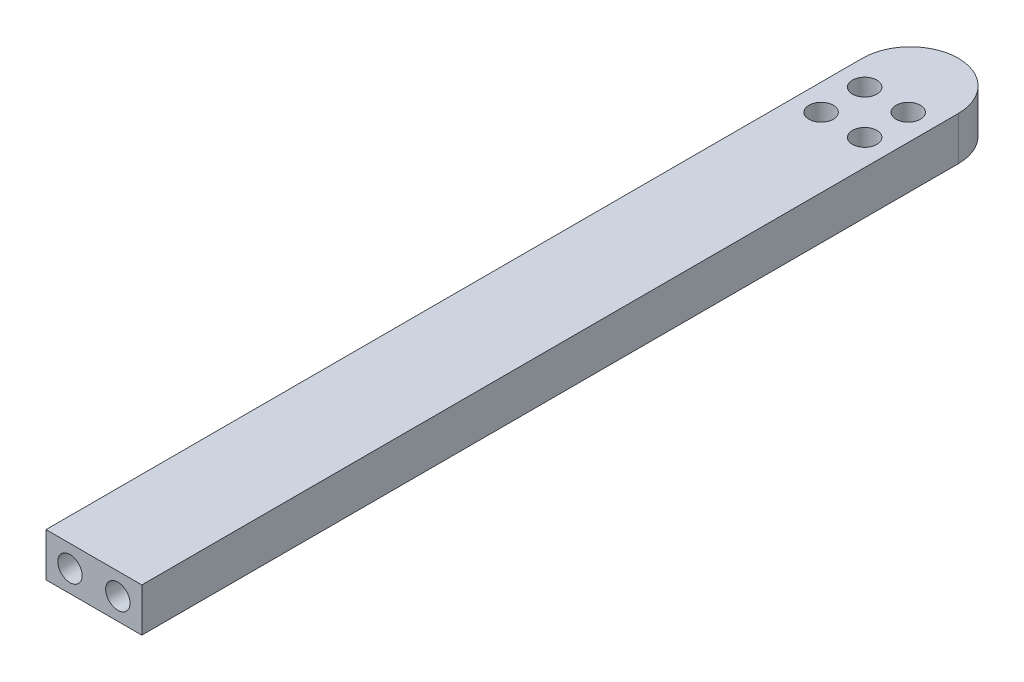
ISO-10303-21;
HEADER;
FILE_DESCRIPTION(('STEP AP214'),'2;1');
FILE_NAME('part.step','',(''),(''),'','','');
FILE_SCHEMA(('AUTOMOTIVE_DESIGN { 1 0 10303 214 1 1 1 1 }'));
ENDSEC;
DATA;
#1=APPLICATION_CONTEXT('core data for automotive mechanical design processes');
#2=APPLICATION_PROTOCOL_DEFINITION('international standard','automotive_design',2000,#1);
#3=PRODUCT_CONTEXT('',#1,'mechanical');
#4=PRODUCT('Part','Part','',(#3));
#5=PRODUCT_RELATED_PRODUCT_CATEGORY('part','',(#4));
#6=PRODUCT_DEFINITION_FORMATION('','',#4);
#7=PRODUCT_DEFINITION_CONTEXT('part definition',#1,'design');
#8=PRODUCT_DEFINITION('design','',#6,#7);
#9=PRODUCT_DEFINITION_SHAPE('','',#8);
#10=(LENGTH_UNIT() NAMED_UNIT(*) SI_UNIT(.MILLI.,.METRE.));
#11=(NAMED_UNIT(*) PLANE_ANGLE_UNIT() SI_UNIT($,.RADIAN.));
#12=(NAMED_UNIT(*) SI_UNIT($,.STERADIAN.) SOLID_ANGLE_UNIT());
#13=UNCERTAINTY_MEASURE_WITH_UNIT(LENGTH_MEASURE(1.E-05),#10,'distance_accuracy_value','');
#14=(GEOMETRIC_REPRESENTATION_CONTEXT(3) GLOBAL_UNCERTAINTY_ASSIGNED_CONTEXT((#13)) GLOBAL_UNIT_ASSIGNED_CONTEXT((#10,
#11,#12)) REPRESENTATION_CONTEXT('',''));
#15=CARTESIAN_POINT('',(0.,0.,0.));
#16=DIRECTION('',(0.,0.,1.));
#17=DIRECTION('',(1.,0.,0.));
#18=AXIS2_PLACEMENT_3D('',#15,#16,#17);
#19=CARTESIAN_POINT('',(0.,0.,88.5));
#20=DIRECTION('',(0.,0.,-1.));
#21=DIRECTION('',(-1.,0.,0.));
#22=AXIS2_PLACEMENT_3D('',#19,#20,#21);
#23=PLANE('',#22);
#24=DIRECTION('',(0.,-1.,0.));
#25=VECTOR('',#24,1.);
#26=CARTESIAN_POINT('',(-5.49999999999999,5.,88.5));
#27=LINE('',#26,#25);
#28=CARTESIAN_POINT('',(-5.49999999999999,5.,88.5));
#29=VERTEX_POINT('',#28);
#30=CARTESIAN_POINT('',(-5.49999999999999,0.,88.5));
#31=VERTEX_POINT('',#30);
#32=EDGE_CURVE('E51',#29,#31,#27,.T.);
#33=ORIENTED_EDGE('',*,*,#32,.T.);
#34=DIRECTION('',(1.,0.,0.));
#35=VECTOR('',#34,1.);
#36=CARTESIAN_POINT('',(-5.49999999999999,0.,88.5));
#37=LINE('',#36,#35);
#38=CARTESIAN_POINT('',(5.50000000000001,0.,88.5));
#39=VERTEX_POINT('',#38);
#40=EDGE_CURVE('E11',#31,#39,#37,.T.);
#41=ORIENTED_EDGE('',*,*,#40,.T.);
#42=DIRECTION('',(0.,-1.,0.));
#43=VECTOR('',#42,1.);
#44=CARTESIAN_POINT('',(5.50000000000001,5.,88.5));
#45=LINE('',#44,#43);
#46=CARTESIAN_POINT('',(5.50000000000001,5.,88.5));
#47=VERTEX_POINT('',#46);
#48=EDGE_CURVE('E65',#47,#39,#45,.T.);
#49=ORIENTED_EDGE('',*,*,#48,.F.);
#50=DIRECTION('',(1.,0.,0.));
#51=VECTOR('',#50,1.);
#52=CARTESIAN_POINT('',(-5.49999999999999,5.,88.5));
#53=LINE('',#52,#51);
#54=EDGE_CURVE('E93',#29,#47,#53,.T.);
#55=ORIENTED_EDGE('',*,*,#54,.F.);
#56=EDGE_LOOP('',(#33,#41,#49,#55));
#57=FACE_BOUND('',#56,.T.);
#58=CARTESIAN_POINT('',(-2.75,2.5,88.5));
#59=DIRECTION('',(0.,0.,-1.));
#60=DIRECTION('',(-1.,0.,0.));
#61=AXIS2_PLACEMENT_3D('',#58,#59,#60);
#62=CIRCLE('',#61,1.4);
#63=CARTESIAN_POINT('',(-4.15,2.5,88.5));
#64=VERTEX_POINT('',#63);
#65=EDGE_CURVE('E110',#64,#64,#62,.T.);
#66=ORIENTED_EDGE('',*,*,#65,.T.);
#67=EDGE_LOOP('',(#66));
#68=FACE_BOUND('',#67,.T.);
#69=CARTESIAN_POINT('',(2.75,2.5,88.5));
#70=DIRECTION('',(0.,0.,-1.));
#71=DIRECTION('',(-1.,0.,0.));
#72=AXIS2_PLACEMENT_3D('',#69,#70,#71);
#73=CIRCLE('',#72,1.4);
#74=CARTESIAN_POINT('',(1.35,2.5,88.5));
#75=VERTEX_POINT('',#74);
#76=EDGE_CURVE('E46',#75,#75,#73,.T.);
#77=ORIENTED_EDGE('',*,*,#76,.T.);
#78=EDGE_LOOP('',(#77));
#79=FACE_BOUND('',#78,.T.);
#80=ADVANCED_FACE('F43',(#57,#68,#79),#23,.F.);
#81=CARTESIAN_POINT('',(-2.75,2.5,83.5));
#82=DIRECTION('',(0.,0.,-1.));
#83=DIRECTION('',(-1.,0.,0.));
#84=AXIS2_PLACEMENT_3D('',#81,#82,#83);
#85=PLANE('',#84);
#86=CARTESIAN_POINT('',(-2.75,2.5,83.5));
#87=DIRECTION('',(0.,0.,-1.));
#88=DIRECTION('',(-1.,0.,0.));
#89=AXIS2_PLACEMENT_3D('',#86,#87,#88);
#90=CIRCLE('',#89,1.4);
#91=CARTESIAN_POINT('',(-4.15,2.5,83.5));
#92=VERTEX_POINT('',#91);
#93=EDGE_CURVE('E148',#92,#92,#90,.T.);
#94=ORIENTED_EDGE('',*,*,#93,.F.);
#95=EDGE_LOOP('',(#94));
#96=FACE_BOUND('',#95,.T.);
#97=ADVANCED_FACE('F159',(#96),#85,.F.);
#98=CARTESIAN_POINT('',(-2.75,2.5,83.5));
#99=DIRECTION('',(0.,0.,1.));
#100=DIRECTION('',(1.,0.,0.));
#101=AXIS2_PLACEMENT_3D('',#98,#99,#100);
#102=CYLINDRICAL_SURFACE('',#101,1.4);
#103=ORIENTED_EDGE('',*,*,#65,.F.);
#104=EDGE_LOOP('',(#103));
#105=FACE_BOUND('',#104,.T.);
#106=ORIENTED_EDGE('',*,*,#93,.T.);
#107=EDGE_LOOP('',(#106));
#108=FACE_BOUND('',#107,.T.);
#109=ADVANCED_FACE('F157',(#105,#108),#102,.F.);
#110=CARTESIAN_POINT('',(2.75,2.5,83.5));
#111=DIRECTION('',(0.,0.,1.));
#112=DIRECTION('',(1.,0.,0.));
#113=AXIS2_PLACEMENT_3D('',#110,#111,#112);
#114=PLANE('',#113);
#115=CARTESIAN_POINT('',(2.75,2.5,83.5));
#116=DIRECTION('',(0.,0.,-1.));
#117=DIRECTION('',(1.,0.,0.));
#118=AXIS2_PLACEMENT_3D('',#115,#116,#117);
#119=CIRCLE('',#118,1.4);
#120=CARTESIAN_POINT('',(4.15,2.5,83.5));
#121=VERTEX_POINT('',#120);
#122=EDGE_CURVE('E151',#121,#121,#119,.T.);
#123=ORIENTED_EDGE('',*,*,#122,.F.);
#124=EDGE_LOOP('',(#123));
#125=FACE_BOUND('',#124,.T.);
#126=ADVANCED_FACE('F167',(#125),#114,.T.);
#127=CARTESIAN_POINT('',(2.75,2.5,83.5));
#128=DIRECTION('',(0.,0.,1.));
#129=DIRECTION('',(1.,0.,0.));
#130=AXIS2_PLACEMENT_3D('',#127,#128,#129);
#131=CYLINDRICAL_SURFACE('',#130,1.4);
#132=ORIENTED_EDGE('',*,*,#76,.F.);
#133=EDGE_LOOP('',(#132));
#134=FACE_BOUND('',#133,.T.);
#135=ORIENTED_EDGE('',*,*,#122,.T.);
#136=EDGE_LOOP('',(#135));
#137=FACE_BOUND('',#136,.T.);
#138=ADVANCED_FACE('F171',(#134,#137),#131,.F.);
#139=CARTESIAN_POINT('',(2.49999999999999,5.,2.5));
#140=DIRECTION('',(0.,-1.,0.));
#141=DIRECTION('',(0.,0.,-1.));
#142=AXIS2_PLACEMENT_3D('',#139,#140,#141);
#143=CYLINDRICAL_SURFACE('',#142,1.4);
#144=CARTESIAN_POINT('',(2.49999999999999,5.,2.5));
#145=DIRECTION('',(0.,1.,0.));
#146=DIRECTION('',(0.,0.,1.));
#147=AXIS2_PLACEMENT_3D('',#144,#145,#146);
#148=CIRCLE('',#147,1.4);
#149=CARTESIAN_POINT('',(2.49999999999999,5.,3.9));
#150=VERTEX_POINT('',#149);
#151=EDGE_CURVE('E142',#150,#150,#148,.T.);
#152=ORIENTED_EDGE('',*,*,#151,.T.);
#153=EDGE_LOOP('',(#152));
#154=FACE_BOUND('',#153,.T.);
#155=CARTESIAN_POINT('',(2.49999999999999,0.,2.5));
#156=DIRECTION('',(0.,1.,0.));
#157=DIRECTION('',(0.,0.,1.));
#158=AXIS2_PLACEMENT_3D('',#155,#156,#157);
#159=CIRCLE('',#158,1.4);
#160=CARTESIAN_POINT('',(2.49999999999999,0.,3.9));
#161=VERTEX_POINT('',#160);
#162=EDGE_CURVE('E145',#161,#161,#159,.T.);
#163=ORIENTED_EDGE('',*,*,#162,.F.);
#164=EDGE_LOOP('',(#163));
#165=FACE_BOUND('',#164,.T.);
#166=ADVANCED_FACE('F174',(#154,#165),#143,.F.);
#167=CARTESIAN_POINT('',(2.5,5.,-2.5));
#168=DIRECTION('',(0.,-1.,0.));
#169=DIRECTION('',(0.,0.,-1.));
#170=AXIS2_PLACEMENT_3D('',#167,#168,#169);
#171=CYLINDRICAL_SURFACE('',#170,1.4);
#172=CARTESIAN_POINT('',(2.5,5.,-2.5));
#173=DIRECTION('',(0.,1.,0.));
#174=DIRECTION('',(0.,0.,-1.));
#175=AXIS2_PLACEMENT_3D('',#172,#173,#174);
#176=CIRCLE('',#175,1.4);
#177=CARTESIAN_POINT('',(2.5,5.,-3.9));
#178=VERTEX_POINT('',#177);
#179=EDGE_CURVE('E130',#178,#178,#176,.T.);
#180=ORIENTED_EDGE('',*,*,#179,.T.);
#181=EDGE_LOOP('',(#180));
#182=FACE_BOUND('',#181,.T.);
#183=CARTESIAN_POINT('',(2.5,0.,-2.5));
#184=DIRECTION('',(0.,1.,0.));
#185=DIRECTION('',(0.,0.,-1.));
#186=AXIS2_PLACEMENT_3D('',#183,#184,#185);
#187=CIRCLE('',#186,1.4);
#188=CARTESIAN_POINT('',(2.5,0.,-3.9));
#189=VERTEX_POINT('',#188);
#190=EDGE_CURVE('E133',#189,#189,#187,.T.);
#191=ORIENTED_EDGE('',*,*,#190,.F.);
#192=EDGE_LOOP('',(#191));
#193=FACE_BOUND('',#192,.T.);
#194=ADVANCED_FACE('F181',(#182,#193),#171,.F.);
#195=CARTESIAN_POINT('',(-2.5,5.,-2.5));
#196=DIRECTION('',(0.,-1.,0.));
#197=DIRECTION('',(0.,0.,-1.));
#198=AXIS2_PLACEMENT_3D('',#195,#196,#197);
#199=CYLINDRICAL_SURFACE('',#198,1.4);
#200=CARTESIAN_POINT('',(-2.5,5.,-2.5));
#201=DIRECTION('',(0.,1.,0.));
#202=DIRECTION('',(0.,0.,1.));
#203=AXIS2_PLACEMENT_3D('',#200,#201,#202);
#204=CIRCLE('',#203,1.4);
#205=CARTESIAN_POINT('',(-2.5,5.,-1.1));
#206=VERTEX_POINT('',#205);
#207=EDGE_CURVE('E121',#206,#206,#204,.T.);
#208=ORIENTED_EDGE('',*,*,#207,.T.);
#209=EDGE_LOOP('',(#208));
#210=FACE_BOUND('',#209,.T.);
#211=CARTESIAN_POINT('',(-2.5,0.,-2.5));
#212=DIRECTION('',(0.,1.,0.));
#213=DIRECTION('',(0.,0.,1.));
#214=AXIS2_PLACEMENT_3D('',#211,#212,#213);
#215=CIRCLE('',#214,1.4);
#216=CARTESIAN_POINT('',(-2.5,0.,-1.1));
#217=VERTEX_POINT('',#216);
#218=EDGE_CURVE('E127',#217,#217,#215,.T.);
#219=ORIENTED_EDGE('',*,*,#218,.F.);
#220=EDGE_LOOP('',(#219));
#221=FACE_BOUND('',#220,.T.);
#222=ADVANCED_FACE('F186',(#210,#221),#199,.F.);
#223=CARTESIAN_POINT('',(-2.50000000000001,5.,2.5));
#224=DIRECTION('',(0.,-1.,0.));
#225=DIRECTION('',(0.,0.,-1.));
#226=AXIS2_PLACEMENT_3D('',#223,#224,#225);
#227=CYLINDRICAL_SURFACE('',#226,1.4);
#228=CARTESIAN_POINT('',(-2.50000000000001,5.,2.5));
#229=DIRECTION('',(0.,1.,0.));
#230=DIRECTION('',(0.,0.,-1.));
#231=AXIS2_PLACEMENT_3D('',#228,#229,#230);
#232=CIRCLE('',#231,1.4);
#233=CARTESIAN_POINT('',(-2.50000000000001,5.,1.1));
#234=VERTEX_POINT('',#233);
#235=EDGE_CURVE('E136',#234,#234,#232,.T.);
#236=ORIENTED_EDGE('',*,*,#235,.T.);
#237=EDGE_LOOP('',(#236));
#238=FACE_BOUND('',#237,.T.);
#239=CARTESIAN_POINT('',(-2.50000000000001,0.,2.5));
#240=DIRECTION('',(0.,1.,0.));
#241=DIRECTION('',(0.,0.,-1.));
#242=AXIS2_PLACEMENT_3D('',#239,#240,#241);
#243=CIRCLE('',#242,1.4);
#244=CARTESIAN_POINT('',(-2.50000000000001,0.,1.1));
#245=VERTEX_POINT('',#244);
#246=EDGE_CURVE('E139',#245,#245,#243,.T.);
#247=ORIENTED_EDGE('',*,*,#246,.F.);
#248=EDGE_LOOP('',(#247));
#249=FACE_BOUND('',#248,.T.);
#250=ADVANCED_FACE('F183',(#238,#249),#227,.F.);
#251=CARTESIAN_POINT('',(0.,5.,-5.25));
#252=DIRECTION('',(0.,-1.,0.));
#253=DIRECTION('',(0.,0.,-1.));
#254=AXIS2_PLACEMENT_3D('',#251,#252,#253);
#255=CYLINDRICAL_SURFACE('',#254,5.5);
#256=CARTESIAN_POINT('',(0.,0.,-5.25));
#257=DIRECTION('',(0.,1.,0.));
#258=DIRECTION('',(0.,0.,-1.));
#259=AXIS2_PLACEMENT_3D('',#256,#257,#258);
#260=CIRCLE('',#259,5.5);
#261=CARTESIAN_POINT('',(5.5,0.,-5.25));
#262=VERTEX_POINT('',#261);
#263=CARTESIAN_POINT('',(-5.5,0.,-5.25));
#264=VERTEX_POINT('',#263);
#265=EDGE_CURVE('E107',#262,#264,#260,.T.);
#266=ORIENTED_EDGE('',*,*,#265,.T.);
#267=DIRECTION('',(0.,-1.,0.));
#268=VECTOR('',#267,1.);
#269=CARTESIAN_POINT('',(-5.5,5.,-5.25));
#270=LINE('',#269,#268);
#271=CARTESIAN_POINT('',(-5.5,5.,-5.25));
#272=VERTEX_POINT('',#271);
#273=EDGE_CURVE('E90',#272,#264,#270,.T.);
#274=ORIENTED_EDGE('',*,*,#273,.F.);
#275=CARTESIAN_POINT('',(0.,5.,-5.25));
#276=DIRECTION('',(0.,1.,0.));
#277=DIRECTION('',(0.,0.,-1.));
#278=AXIS2_PLACEMENT_3D('',#275,#276,#277);
#279=CIRCLE('',#278,5.5);
#280=CARTESIAN_POINT('',(5.5,5.,-5.25));
#281=VERTEX_POINT('',#280);
#282=EDGE_CURVE('E94',#281,#272,#279,.T.);
#283=ORIENTED_EDGE('',*,*,#282,.F.);
#284=DIRECTION('',(0.,-1.,0.));
#285=VECTOR('',#284,1.);
#286=CARTESIAN_POINT('',(5.5,5.,-5.25));
#287=LINE('',#286,#285);
#288=EDGE_CURVE('E111',#281,#262,#287,.T.);
#289=ORIENTED_EDGE('',*,*,#288,.T.);
#290=EDGE_LOOP('',(#266,#274,#283,#289));
#291=FACE_BOUND('',#290,.T.);
#292=ADVANCED_FACE('F105',(#291),#255,.T.);
#293=CARTESIAN_POINT('',(0.,5.,-5.25));
#294=DIRECTION('',(0.,-1.,0.));
#295=DIRECTION('',(0.,0.,-1.));
#296=AXIS2_PLACEMENT_3D('',#293,#294,#295);
#297=PLANE('',#296);
#298=ORIENTED_EDGE('',*,*,#282,.T.);
#299=DIRECTION('',(0.,0.,1.));
#300=VECTOR('',#299,1.);
#301=CARTESIAN_POINT('',(-5.5,5.,-5.25));
#302=LINE('',#301,#300);
#303=EDGE_CURVE('E85',#272,#29,#302,.T.);
#304=ORIENTED_EDGE('',*,*,#303,.T.);
#305=ORIENTED_EDGE('',*,*,#54,.T.);
#306=DIRECTION('',(0.,0.,-1.));
#307=VECTOR('',#306,1.);
#308=CARTESIAN_POINT('',(5.5,5.,-5.25));
#309=LINE('',#308,#307);
#310=EDGE_CURVE('E99',#47,#281,#309,.T.);
#311=ORIENTED_EDGE('',*,*,#310,.T.);
#312=EDGE_LOOP('',(#298,#304,#305,#311));
#313=FACE_BOUND('',#312,.T.);
#314=ORIENTED_EDGE('',*,*,#207,.F.);
#315=EDGE_LOOP('',(#314));
#316=FACE_BOUND('',#315,.T.);
#317=ORIENTED_EDGE('',*,*,#179,.F.);
#318=EDGE_LOOP('',(#317));
#319=FACE_BOUND('',#318,.T.);
#320=ORIENTED_EDGE('',*,*,#235,.F.);
#321=EDGE_LOOP('',(#320));
#322=FACE_BOUND('',#321,.T.);
#323=ORIENTED_EDGE('',*,*,#151,.F.);
#324=EDGE_LOOP('',(#323));
#325=FACE_BOUND('',#324,.T.);
#326=ADVANCED_FACE('F97',(#313,#316,#319,#322,#325),#297,.F.);
#327=CARTESIAN_POINT('',(5.5,5.,-5.25));
#328=DIRECTION('',(-1.,0.,0.));
#329=DIRECTION('',(0.,0.,1.));
#330=AXIS2_PLACEMENT_3D('',#327,#328,#329);
#331=PLANE('',#330);
#332=DIRECTION('',(0.,0.,-1.));
#333=VECTOR('',#332,1.);
#334=CARTESIAN_POINT('',(5.5,0.,-5.25));
#335=LINE('',#334,#333);
#336=EDGE_CURVE('E103',#39,#262,#335,.T.);
#337=ORIENTED_EDGE('',*,*,#336,.T.);
#338=ORIENTED_EDGE('',*,*,#288,.F.);
#339=ORIENTED_EDGE('',*,*,#310,.F.);
#340=ORIENTED_EDGE('',*,*,#48,.T.);
#341=EDGE_LOOP('',(#337,#338,#339,#340));
#342=FACE_BOUND('',#341,.T.);
#343=ADVANCED_FACE('F196',(#342),#331,.F.);
#344=CARTESIAN_POINT('',(0.,0.,-5.25));
#345=DIRECTION('',(0.,-1.,0.));
#346=DIRECTION('',(0.,0.,-1.));
#347=AXIS2_PLACEMENT_3D('',#344,#345,#346);
#348=PLANE('',#347);
#349=ORIENTED_EDGE('',*,*,#246,.T.);
#350=EDGE_LOOP('',(#349));
#351=FACE_BOUND('',#350,.T.);
#352=ORIENTED_EDGE('',*,*,#218,.T.);
#353=EDGE_LOOP('',(#352));
#354=FACE_BOUND('',#353,.T.);
#355=ORIENTED_EDGE('',*,*,#265,.F.);
#356=ORIENTED_EDGE('',*,*,#336,.F.);
#357=ORIENTED_EDGE('',*,*,#40,.F.);
#358=DIRECTION('',(0.,0.,1.));
#359=VECTOR('',#358,1.);
#360=CARTESIAN_POINT('',(-5.5,0.,-5.25));
#361=LINE('',#360,#359);
#362=EDGE_CURVE('E118',#264,#31,#361,.T.);
#363=ORIENTED_EDGE('',*,*,#362,.F.);
#364=EDGE_LOOP('',(#355,#356,#357,#363));
#365=FACE_BOUND('',#364,.T.);
#366=ORIENTED_EDGE('',*,*,#190,.T.);
#367=EDGE_LOOP('',(#366));
#368=FACE_BOUND('',#367,.T.);
#369=ORIENTED_EDGE('',*,*,#162,.T.);
#370=EDGE_LOOP('',(#369));
#371=FACE_BOUND('',#370,.T.);
#372=ADVANCED_FACE('F197',(#351,#354,#365,#368,#371),#348,.T.);
#373=CARTESIAN_POINT('',(-5.5,5.,-5.25));
#374=DIRECTION('',(1.,0.,0.));
#375=DIRECTION('',(0.,0.,-1.));
#376=AXIS2_PLACEMENT_3D('',#373,#374,#375);
#377=PLANE('',#376);
#378=ORIENTED_EDGE('',*,*,#362,.T.);
#379=ORIENTED_EDGE('',*,*,#32,.F.);
#380=ORIENTED_EDGE('',*,*,#303,.F.);
#381=ORIENTED_EDGE('',*,*,#273,.T.);
#382=EDGE_LOOP('',(#378,#379,#380,#381));
#383=FACE_BOUND('',#382,.T.);
#384=ADVANCED_FACE('F88',(#383),#377,.F.);
#385=CLOSED_SHELL('',(#80,#97,#109,#126,#138,#166,#194,#222,#250,#292,#326,#343,#372,#384));
#386=MANIFOLD_SOLID_BREP('B2',#385);
#387=ADVANCED_BREP_SHAPE_REPRESENTATION('',(#18,#386),#14);
#388=SHAPE_DEFINITION_REPRESENTATION(#9,#387);
ENDSEC;
END-ISO-10303-21;
